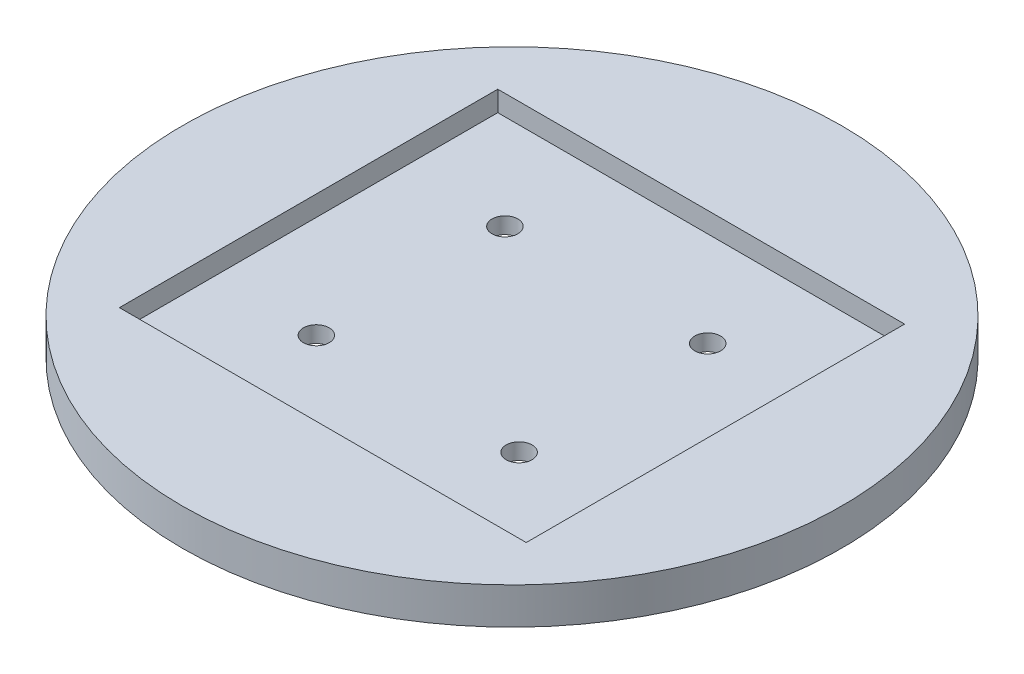
ISO-10303-21;
HEADER;
FILE_DESCRIPTION(('STEP AP214'),'2;1');
FILE_NAME('part.step','',(''),(''),'','','');
FILE_SCHEMA(('AUTOMOTIVE_DESIGN { 1 0 10303 214 1 1 1 1 }'));
ENDSEC;
DATA;
#1=APPLICATION_CONTEXT('core data for automotive mechanical design processes');
#2=APPLICATION_PROTOCOL_DEFINITION('international standard','automotive_design',2000,#1);
#3=PRODUCT_CONTEXT('',#1,'mechanical');
#4=PRODUCT('Part','Part','',(#3));
#5=PRODUCT_RELATED_PRODUCT_CATEGORY('part','',(#4));
#6=PRODUCT_DEFINITION_FORMATION('','',#4);
#7=PRODUCT_DEFINITION_CONTEXT('part definition',#1,'design');
#8=PRODUCT_DEFINITION('design','',#6,#7);
#9=PRODUCT_DEFINITION_SHAPE('','',#8);
#10=(LENGTH_UNIT() NAMED_UNIT(*) SI_UNIT(.MILLI.,.METRE.));
#11=(NAMED_UNIT(*) PLANE_ANGLE_UNIT() SI_UNIT($,.RADIAN.));
#12=(NAMED_UNIT(*) SI_UNIT($,.STERADIAN.) SOLID_ANGLE_UNIT());
#13=UNCERTAINTY_MEASURE_WITH_UNIT(LENGTH_MEASURE(1.E-05),#10,'distance_accuracy_value','');
#14=(GEOMETRIC_REPRESENTATION_CONTEXT(3) GLOBAL_UNCERTAINTY_ASSIGNED_CONTEXT((#13)) GLOBAL_UNIT_ASSIGNED_CONTEXT((#10,
#11,#12)) REPRESENTATION_CONTEXT('',''));
#15=CARTESIAN_POINT('',(0.,0.,0.));
#16=DIRECTION('',(0.,0.,1.));
#17=DIRECTION('',(1.,0.,0.));
#18=AXIS2_PLACEMENT_3D('',#15,#16,#17);
#19=CARTESIAN_POINT('',(0.,0.,0.));
#20=DIRECTION('',(0.,1.,0.));
#21=DIRECTION('',(0.,0.,1.));
#22=AXIS2_PLACEMENT_3D('',#19,#20,#21);
#23=PLANE('',#22);
#24=CARTESIAN_POINT('',(24.9195717384663,0.,23.1752017167737));
#25=DIRECTION('',(0.,-1.,0.));
#26=DIRECTION('',(0.,0.,-1.));
#27=AXIS2_PLACEMENT_3D('',#24,#25,#26);
#28=CIRCLE('',#27,3.175);
#29=CARTESIAN_POINT('',(24.9195717384663,0.,20.0002017167737));
#30=VERTEX_POINT('',#29);
#31=EDGE_CURVE('E139',#30,#30,#28,.T.);
#32=ORIENTED_EDGE('',*,*,#31,.F.);
#33=EDGE_LOOP('',(#32));
#34=FACE_BOUND('',#33,.T.);
#35=CARTESIAN_POINT('',(0.,0.,0.));
#36=DIRECTION('',(0.,1.,0.));
#37=DIRECTION('',(0.,0.,1.));
#38=AXIS2_PLACEMENT_3D('',#35,#36,#37);
#39=CIRCLE('',#38,81.0015431951762);
#40=CARTESIAN_POINT('',(0.,0.,81.0015431951762));
#41=VERTEX_POINT('',#40);
#42=EDGE_CURVE('E39',#41,#41,#39,.T.);
#43=ORIENTED_EDGE('',*,*,#42,.F.);
#44=EDGE_LOOP('',(#43));
#45=FACE_BOUND('',#44,.T.);
#46=CARTESIAN_POINT('',(-24.9195717384663,0.,23.1752017167737));
#47=DIRECTION('',(0.,1.,0.));
#48=DIRECTION('',(0.,0.,1.));
#49=AXIS2_PLACEMENT_3D('',#46,#47,#48);
#50=CIRCLE('',#49,3.175);
#51=CARTESIAN_POINT('',(-24.9195717384663,0.,26.3502017167737));
#52=VERTEX_POINT('',#51);
#53=EDGE_CURVE('E146',#52,#52,#50,.T.);
#54=ORIENTED_EDGE('',*,*,#53,.T.);
#55=EDGE_LOOP('',(#54));
#56=FACE_BOUND('',#55,.T.);
#57=CARTESIAN_POINT('',(-24.9195717384663,0.,-23.1752017167737));
#58=DIRECTION('',(0.,-1.,0.));
#59=DIRECTION('',(0.,0.,-1.));
#60=AXIS2_PLACEMENT_3D('',#57,#58,#59);
#61=CIRCLE('',#60,3.175);
#62=CARTESIAN_POINT('',(-24.9195717384663,0.,-26.3502017167737));
#63=VERTEX_POINT('',#62);
#64=EDGE_CURVE('E150',#63,#63,#61,.T.);
#65=ORIENTED_EDGE('',*,*,#64,.F.);
#66=EDGE_LOOP('',(#65));
#67=FACE_BOUND('',#66,.T.);
#68=CARTESIAN_POINT('',(24.9195717384663,0.,-23.1752017167737));
#69=DIRECTION('',(0.,1.,0.));
#70=DIRECTION('',(0.,0.,1.));
#71=AXIS2_PLACEMENT_3D('',#68,#69,#70);
#72=CIRCLE('',#71,3.175);
#73=CARTESIAN_POINT('',(24.9195717384663,0.,-20.0002017167737));
#74=VERTEX_POINT('',#73);
#75=EDGE_CURVE('E153',#74,#74,#72,.T.);
#76=ORIENTED_EDGE('',*,*,#75,.T.);
#77=EDGE_LOOP('',(#76));
#78=FACE_BOUND('',#77,.T.);
#79=ADVANCED_FACE('F35',(#34,#45,#56,#67,#78),#23,.F.);
#80=CARTESIAN_POINT('',(0.,9.,0.));
#81=DIRECTION('',(0.,1.,0.));
#82=DIRECTION('',(0.,0.,1.));
#83=AXIS2_PLACEMENT_3D('',#80,#81,#82);
#84=PLANE('',#83);
#85=CARTESIAN_POINT('',(0.,9.,0.));
#86=DIRECTION('',(0.,1.,0.));
#87=DIRECTION('',(0.,0.,1.));
#88=AXIS2_PLACEMENT_3D('',#85,#86,#87);
#89=CIRCLE('',#88,81.0015431951762);
#90=CARTESIAN_POINT('',(0.,9.,81.0015431951762));
#91=VERTEX_POINT('',#90);
#92=EDGE_CURVE('E11',#91,#91,#89,.T.);
#93=ORIENTED_EDGE('',*,*,#92,.T.);
#94=EDGE_LOOP('',(#93));
#95=FACE_BOUND('',#94,.T.);
#96=DIRECTION('',(1.,0.,0.));
#97=VECTOR('',#96,1.);
#98=CARTESIAN_POINT('',(0.,9.,46.5));
#99=LINE('',#98,#97);
#100=CARTESIAN_POINT('',(-50.,9.,46.5));
#101=VERTEX_POINT('',#100);
#102=CARTESIAN_POINT('',(50.,9.,46.5));
#103=VERTEX_POINT('',#102);
#104=EDGE_CURVE('E50',#101,#103,#99,.T.);
#105=ORIENTED_EDGE('',*,*,#104,.F.);
#106=DIRECTION('',(0.,0.,-1.));
#107=VECTOR('',#106,1.);
#108=CARTESIAN_POINT('',(-50.,9.,0.));
#109=LINE('',#108,#107);
#110=CARTESIAN_POINT('',(-50.,9.,-46.5));
#111=VERTEX_POINT('',#110);
#112=EDGE_CURVE('E102',#101,#111,#109,.T.);
#113=ORIENTED_EDGE('',*,*,#112,.T.);
#114=DIRECTION('',(1.,0.,0.));
#115=VECTOR('',#114,1.);
#116=CARTESIAN_POINT('',(0.,9.,-46.5));
#117=LINE('',#116,#115);
#118=CARTESIAN_POINT('',(50.,9.,-46.5));
#119=VERTEX_POINT('',#118);
#120=EDGE_CURVE('E110',#111,#119,#117,.T.);
#121=ORIENTED_EDGE('',*,*,#120,.T.);
#122=DIRECTION('',(0.,0.,-1.));
#123=VECTOR('',#122,1.);
#124=CARTESIAN_POINT('',(50.,9.,0.));
#125=LINE('',#124,#123);
#126=EDGE_CURVE('E95',#103,#119,#125,.T.);
#127=ORIENTED_EDGE('',*,*,#126,.F.);
#128=EDGE_LOOP('',(#105,#113,#121,#127));
#129=FACE_BOUND('',#128,.T.);
#130=ADVANCED_FACE('F117',(#95,#129),#84,.T.);
#131=CARTESIAN_POINT('',(0.,9.,0.));
#132=DIRECTION('',(0.,-1.,0.));
#133=DIRECTION('',(0.,0.,-1.));
#134=AXIS2_PLACEMENT_3D('',#131,#132,#133);
#135=CYLINDRICAL_SURFACE('',#134,81.0015431951762);
#136=ORIENTED_EDGE('',*,*,#92,.F.);
#137=EDGE_LOOP('',(#136));
#138=FACE_BOUND('',#137,.T.);
#139=ORIENTED_EDGE('',*,*,#42,.T.);
#140=EDGE_LOOP('',(#139));
#141=FACE_BOUND('',#140,.T.);
#142=ADVANCED_FACE('F37',(#138,#141),#135,.T.);
#143=CARTESIAN_POINT('',(0.,4.,46.5));
#144=DIRECTION('',(0.,0.,1.));
#145=DIRECTION('',(1.,0.,0.));
#146=AXIS2_PLACEMENT_3D('',#143,#144,#145);
#147=PLANE('',#146);
#148=ORIENTED_EDGE('',*,*,#104,.T.);
#149=DIRECTION('',(0.,1.,0.));
#150=VECTOR('',#149,1.);
#151=CARTESIAN_POINT('',(50.,4.,46.5));
#152=LINE('',#151,#150);
#153=CARTESIAN_POINT('',(50.,4.,46.5));
#154=VERTEX_POINT('',#153);
#155=EDGE_CURVE('E74',#154,#103,#152,.T.);
#156=ORIENTED_EDGE('',*,*,#155,.F.);
#157=DIRECTION('',(1.,0.,0.));
#158=VECTOR('',#157,1.);
#159=CARTESIAN_POINT('',(0.,4.,46.5));
#160=LINE('',#159,#158);
#161=CARTESIAN_POINT('',(-50.,4.,46.5));
#162=VERTEX_POINT('',#161);
#163=EDGE_CURVE('E100',#162,#154,#160,.T.);
#164=ORIENTED_EDGE('',*,*,#163,.F.);
#165=DIRECTION('',(0.,1.,0.));
#166=VECTOR('',#165,1.);
#167=CARTESIAN_POINT('',(-50.,4.,46.5));
#168=LINE('',#167,#166);
#169=EDGE_CURVE('E58',#162,#101,#168,.T.);
#170=ORIENTED_EDGE('',*,*,#169,.T.);
#171=EDGE_LOOP('',(#148,#156,#164,#170));
#172=FACE_BOUND('',#171,.T.);
#173=ADVANCED_FACE('F119',(#172),#147,.F.);
#174=CARTESIAN_POINT('',(-50.,4.,0.));
#175=DIRECTION('',(1.,0.,0.));
#176=DIRECTION('',(0.,0.,-1.));
#177=AXIS2_PLACEMENT_3D('',#174,#175,#176);
#178=PLANE('',#177);
#179=ORIENTED_EDGE('',*,*,#112,.F.);
#180=ORIENTED_EDGE('',*,*,#169,.F.);
#181=DIRECTION('',(0.,0.,-1.));
#182=VECTOR('',#181,1.);
#183=CARTESIAN_POINT('',(-50.,4.,0.));
#184=LINE('',#183,#182);
#185=CARTESIAN_POINT('',(-50.,4.,-46.5));
#186=VERTEX_POINT('',#185);
#187=EDGE_CURVE('E88',#162,#186,#184,.T.);
#188=ORIENTED_EDGE('',*,*,#187,.T.);
#189=DIRECTION('',(0.,1.,0.));
#190=VECTOR('',#189,1.);
#191=CARTESIAN_POINT('',(-50.,4.,-46.5));
#192=LINE('',#191,#190);
#193=EDGE_CURVE('E85',#186,#111,#192,.T.);
#194=ORIENTED_EDGE('',*,*,#193,.T.);
#195=EDGE_LOOP('',(#179,#180,#188,#194));
#196=FACE_BOUND('',#195,.T.);
#197=ADVANCED_FACE('F118',(#196),#178,.T.);
#198=CARTESIAN_POINT('',(0.,4.,-46.5));
#199=DIRECTION('',(0.,0.,1.));
#200=DIRECTION('',(1.,0.,0.));
#201=AXIS2_PLACEMENT_3D('',#198,#199,#200);
#202=PLANE('',#201);
#203=ORIENTED_EDGE('',*,*,#120,.F.);
#204=ORIENTED_EDGE('',*,*,#193,.F.);
#205=DIRECTION('',(1.,0.,0.));
#206=VECTOR('',#205,1.);
#207=CARTESIAN_POINT('',(0.,4.,-46.5));
#208=LINE('',#207,#206);
#209=CARTESIAN_POINT('',(50.,4.,-46.5));
#210=VERTEX_POINT('',#209);
#211=EDGE_CURVE('E79',#186,#210,#208,.T.);
#212=ORIENTED_EDGE('',*,*,#211,.T.);
#213=DIRECTION('',(0.,1.,0.));
#214=VECTOR('',#213,1.);
#215=CARTESIAN_POINT('',(50.,4.,-46.5));
#216=LINE('',#215,#214);
#217=EDGE_CURVE('E82',#210,#119,#216,.T.);
#218=ORIENTED_EDGE('',*,*,#217,.T.);
#219=EDGE_LOOP('',(#203,#204,#212,#218));
#220=FACE_BOUND('',#219,.T.);
#221=ADVANCED_FACE('F81',(#220),#202,.T.);
#222=CARTESIAN_POINT('',(50.,4.,0.));
#223=DIRECTION('',(1.,0.,0.));
#224=DIRECTION('',(0.,0.,-1.));
#225=AXIS2_PLACEMENT_3D('',#222,#223,#224);
#226=PLANE('',#225);
#227=ORIENTED_EDGE('',*,*,#126,.T.);
#228=ORIENTED_EDGE('',*,*,#217,.F.);
#229=DIRECTION('',(0.,0.,-1.));
#230=VECTOR('',#229,1.);
#231=CARTESIAN_POINT('',(50.,4.,0.));
#232=LINE('',#231,#230);
#233=EDGE_CURVE('E89',#154,#210,#232,.T.);
#234=ORIENTED_EDGE('',*,*,#233,.F.);
#235=ORIENTED_EDGE('',*,*,#155,.T.);
#236=EDGE_LOOP('',(#227,#228,#234,#235));
#237=FACE_BOUND('',#236,.T.);
#238=ADVANCED_FACE('F92',(#237),#226,.F.);
#239=CARTESIAN_POINT('',(0.,4.,0.));
#240=DIRECTION('',(0.,1.,0.));
#241=DIRECTION('',(0.,0.,1.));
#242=AXIS2_PLACEMENT_3D('',#239,#240,#241);
#243=PLANE('',#242);
#244=CARTESIAN_POINT('',(24.9195717384663,4.,23.1752017167737));
#245=DIRECTION('',(0.,1.,0.));
#246=DIRECTION('',(0.,0.,1.));
#247=AXIS2_PLACEMENT_3D('',#244,#245,#246);
#248=CIRCLE('',#247,3.175);
#249=CARTESIAN_POINT('',(24.9195717384663,4.,26.3502017167737));
#250=VERTEX_POINT('',#249);
#251=EDGE_CURVE('E165',#250,#250,#248,.F.);
#252=ORIENTED_EDGE('',*,*,#251,.T.);
#253=EDGE_LOOP('',(#252));
#254=FACE_BOUND('',#253,.T.);
#255=CARTESIAN_POINT('',(-24.9195717384663,4.,23.1752017167737));
#256=DIRECTION('',(0.,1.,0.));
#257=DIRECTION('',(0.,0.,1.));
#258=AXIS2_PLACEMENT_3D('',#255,#256,#257);
#259=CIRCLE('',#258,3.175);
#260=CARTESIAN_POINT('',(-24.9195717384663,4.,26.3502017167737));
#261=VERTEX_POINT('',#260);
#262=EDGE_CURVE('E108',#261,#261,#259,.T.);
#263=ORIENTED_EDGE('',*,*,#262,.F.);
#264=EDGE_LOOP('',(#263));
#265=FACE_BOUND('',#264,.T.);
#266=ORIENTED_EDGE('',*,*,#163,.T.);
#267=ORIENTED_EDGE('',*,*,#233,.T.);
#268=ORIENTED_EDGE('',*,*,#211,.F.);
#269=ORIENTED_EDGE('',*,*,#187,.F.);
#270=EDGE_LOOP('',(#266,#267,#268,#269));
#271=FACE_BOUND('',#270,.T.);
#272=CARTESIAN_POINT('',(24.9195717384663,4.,-23.1752017167737));
#273=DIRECTION('',(0.,1.,0.));
#274=DIRECTION('',(0.,0.,1.));
#275=AXIS2_PLACEMENT_3D('',#272,#273,#274);
#276=CIRCLE('',#275,3.175);
#277=CARTESIAN_POINT('',(24.9195717384663,4.,-20.0002017167737));
#278=VERTEX_POINT('',#277);
#279=EDGE_CURVE('E162',#278,#278,#276,.T.);
#280=ORIENTED_EDGE('',*,*,#279,.F.);
#281=EDGE_LOOP('',(#280));
#282=FACE_BOUND('',#281,.T.);
#283=CARTESIAN_POINT('',(-24.9195717384663,4.,-23.1752017167737));
#284=DIRECTION('',(0.,1.,0.));
#285=DIRECTION('',(0.,0.,1.));
#286=AXIS2_PLACEMENT_3D('',#283,#284,#285);
#287=CIRCLE('',#286,3.175);
#288=CARTESIAN_POINT('',(-24.9195717384663,4.,-20.0002017167737));
#289=VERTEX_POINT('',#288);
#290=EDGE_CURVE('E156',#289,#289,#287,.F.);
#291=ORIENTED_EDGE('',*,*,#290,.T.);
#292=EDGE_LOOP('',(#291));
#293=FACE_BOUND('',#292,.T.);
#294=ADVANCED_FACE('F98',(#254,#265,#271,#282,#293),#243,.T.);
#295=CARTESIAN_POINT('',(-24.9195717384663,0.,23.1752017167737));
#296=DIRECTION('',(0.,1.,0.));
#297=DIRECTION('',(0.,0.,1.));
#298=AXIS2_PLACEMENT_3D('',#295,#296,#297);
#299=CYLINDRICAL_SURFACE('',#298,3.175);
#300=ORIENTED_EDGE('',*,*,#262,.T.);
#301=EDGE_LOOP('',(#300));
#302=FACE_BOUND('',#301,.T.);
#303=ORIENTED_EDGE('',*,*,#53,.F.);
#304=EDGE_LOOP('',(#303));
#305=FACE_BOUND('',#304,.T.);
#306=ADVANCED_FACE('F171',(#302,#305),#299,.F.);
#307=CARTESIAN_POINT('',(-24.9195717384663,0.,-23.1752017167737));
#308=DIRECTION('',(0.,1.,0.));
#309=DIRECTION('',(0.,0.,1.));
#310=AXIS2_PLACEMENT_3D('',#307,#308,#309);
#311=CYLINDRICAL_SURFACE('',#310,3.175);
#312=ORIENTED_EDGE('',*,*,#290,.F.);
#313=EDGE_LOOP('',(#312));
#314=FACE_BOUND('',#313,.T.);
#315=ORIENTED_EDGE('',*,*,#64,.T.);
#316=EDGE_LOOP('',(#315));
#317=FACE_BOUND('',#316,.T.);
#318=ADVANCED_FACE('F181',(#314,#317),#311,.F.);
#319=CARTESIAN_POINT('',(24.9195717384663,0.,-23.1752017167737));
#320=DIRECTION('',(0.,1.,0.));
#321=DIRECTION('',(0.,0.,1.));
#322=AXIS2_PLACEMENT_3D('',#319,#320,#321);
#323=CYLINDRICAL_SURFACE('',#322,3.175);
#324=ORIENTED_EDGE('',*,*,#279,.T.);
#325=EDGE_LOOP('',(#324));
#326=FACE_BOUND('',#325,.T.);
#327=ORIENTED_EDGE('',*,*,#75,.F.);
#328=EDGE_LOOP('',(#327));
#329=FACE_BOUND('',#328,.T.);
#330=ADVANCED_FACE('F221',(#326,#329),#323,.F.);
#331=CARTESIAN_POINT('',(24.9195717384663,0.,23.1752017167737));
#332=DIRECTION('',(0.,1.,0.));
#333=DIRECTION('',(0.,0.,1.));
#334=AXIS2_PLACEMENT_3D('',#331,#332,#333);
#335=CYLINDRICAL_SURFACE('',#334,3.175);
#336=ORIENTED_EDGE('',*,*,#251,.F.);
#337=EDGE_LOOP('',(#336));
#338=FACE_BOUND('',#337,.T.);
#339=ORIENTED_EDGE('',*,*,#31,.T.);
#340=EDGE_LOOP('',(#339));
#341=FACE_BOUND('',#340,.T.);
#342=ADVANCED_FACE('F230',(#338,#341),#335,.F.);
#343=CLOSED_SHELL('',(#79,#130,#142,#173,#197,#221,#238,#294,#306,#318,#330,#342));
#344=MANIFOLD_SOLID_BREP('B2',#343);
#345=ADVANCED_BREP_SHAPE_REPRESENTATION('',(#18,#344),#14);
#346=SHAPE_DEFINITION_REPRESENTATION(#9,#345);
ENDSEC;
END-ISO-10303-21;
